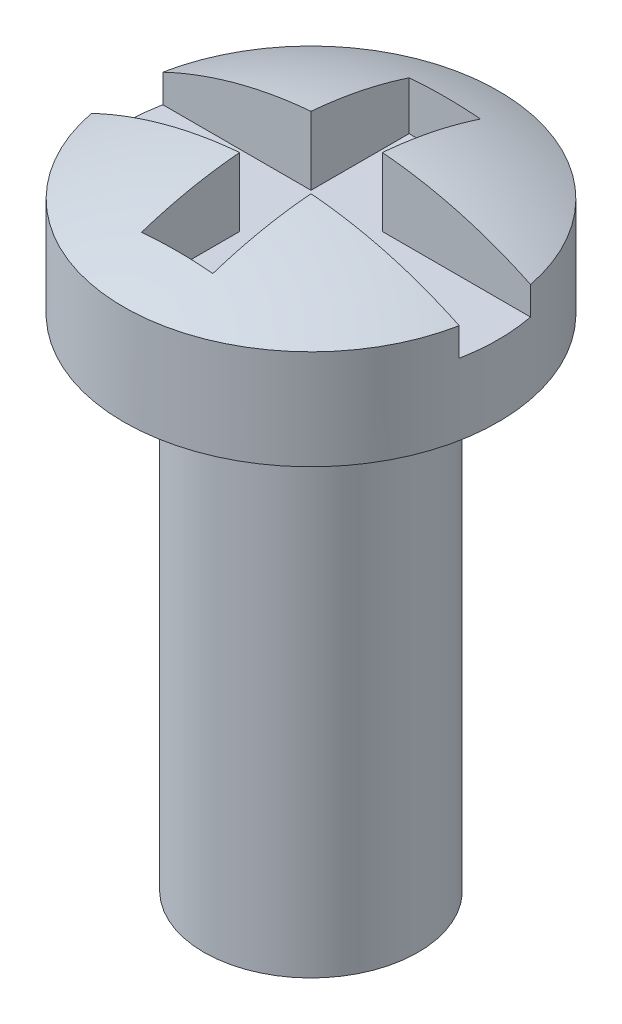
ISO-10303-21;
HEADER;
FILE_DESCRIPTION(('STEP AP214'),'2;1');
FILE_NAME('part.step','',(''),(''),'','','');
FILE_SCHEMA(('AUTOMOTIVE_DESIGN { 1 0 10303 214 1 1 1 1 }'));
ENDSEC;
DATA;
#1=APPLICATION_CONTEXT('core data for automotive mechanical design processes');
#2=APPLICATION_PROTOCOL_DEFINITION('international standard','automotive_design',2000,#1);
#3=PRODUCT_CONTEXT('',#1,'mechanical');
#4=PRODUCT('Part','Part','',(#3));
#5=PRODUCT_RELATED_PRODUCT_CATEGORY('part','',(#4));
#6=PRODUCT_DEFINITION_FORMATION('','',#4);
#7=PRODUCT_DEFINITION_CONTEXT('part definition',#1,'design');
#8=PRODUCT_DEFINITION('design','',#6,#7);
#9=PRODUCT_DEFINITION_SHAPE('','',#8);
#10=(LENGTH_UNIT() NAMED_UNIT(*) SI_UNIT(.MILLI.,.METRE.));
#11=(NAMED_UNIT(*) PLANE_ANGLE_UNIT() SI_UNIT($,.RADIAN.));
#12=(NAMED_UNIT(*) SI_UNIT($,.STERADIAN.) SOLID_ANGLE_UNIT());
#13=UNCERTAINTY_MEASURE_WITH_UNIT(LENGTH_MEASURE(1.E-05),#10,'distance_accuracy_value','');
#14=(GEOMETRIC_REPRESENTATION_CONTEXT(3) GLOBAL_UNCERTAINTY_ASSIGNED_CONTEXT((#13)) GLOBAL_UNIT_ASSIGNED_CONTEXT((#10,
#11,#12)) REPRESENTATION_CONTEXT('',''));
#15=CARTESIAN_POINT('',(0.,0.,0.));
#16=DIRECTION('',(0.,0.,1.));
#17=DIRECTION('',(1.,0.,0.));
#18=AXIS2_PLACEMENT_3D('',#15,#16,#17);
#19=CARTESIAN_POINT('',(-3.50234861591695,8.,-0.5));
#20=DIRECTION('',(0.,0.,-1.));
#21=DIRECTION('',(-1.,0.,0.));
#22=AXIS2_PLACEMENT_3D('',#19,#20,#21);
#23=PLANE('',#22);
#24=CARTESIAN_POINT('',(0.,3.,-0.5));
#25=DIRECTION('',(0.,0.,-1.));
#26=DIRECTION('',(-1.,0.,0.));
#27=AXIS2_PLACEMENT_3D('',#24,#25,#26);
#28=CIRCLE('',#27,5.9791303715507);
#29=CARTESIAN_POINT('',(-2.57694101601104,8.39531046372681,-0.5));
#30=VERTEX_POINT('',#29);
#31=CARTESIAN_POINT('',(-0.5,8.95818764390649,-0.5));
#32=VERTEX_POINT('',#31);
#33=EDGE_CURVE('E218',#30,#32,#28,.T.);
#34=ORIENTED_EDGE('',*,*,#33,.F.);
#35=DIRECTION('',(0.,-1.,0.));
#36=VECTOR('',#35,1.);
#37=CARTESIAN_POINT('',(-2.57694101601104,9.,-0.5));
#38=LINE('',#37,#36);
#39=CARTESIAN_POINT('',(-2.57694101601104,8.,-0.5));
#40=VERTEX_POINT('',#39);
#41=EDGE_CURVE('E161',#40,#30,#38,.F.);
#42=ORIENTED_EDGE('',*,*,#41,.F.);
#43=DIRECTION('',(-1.,0.,0.));
#44=VECTOR('',#43,1.);
#45=CARTESIAN_POINT('',(-3.50234861591695,8.,-0.5));
#46=LINE('',#45,#44);
#47=CARTESIAN_POINT('',(-0.5,8.,-0.5));
#48=VERTEX_POINT('',#47);
#49=EDGE_CURVE('E152',#48,#40,#46,.T.);
#50=ORIENTED_EDGE('',*,*,#49,.F.);
#51=DIRECTION('',(0.,1.,0.));
#52=VECTOR('',#51,1.);
#53=CARTESIAN_POINT('',(-0.5,8.,-0.5));
#54=LINE('',#53,#52);
#55=EDGE_CURVE('E145',#48,#32,#54,.T.);
#56=ORIENTED_EDGE('',*,*,#55,.T.);
#57=EDGE_LOOP('',(#34,#42,#50,#56));
#58=FACE_BOUND('',#57,.T.);
#59=ADVANCED_FACE('F29',(#58),#23,.F.);
#60=CARTESIAN_POINT('',(-3.50234861591695,8.,0.5));
#61=DIRECTION('',(0.,0.,1.));
#62=DIRECTION('',(1.,0.,0.));
#63=AXIS2_PLACEMENT_3D('',#60,#61,#62);
#64=PLANE('',#63);
#65=CARTESIAN_POINT('',(0.,3.,0.5));
#66=DIRECTION('',(0.,0.,1.));
#67=DIRECTION('',(1.,0.,0.));
#68=AXIS2_PLACEMENT_3D('',#65,#66,#67);
#69=CIRCLE('',#68,5.9791303715507);
#70=CARTESIAN_POINT('',(-0.499999999999999,8.95818764390649,0.5));
#71=VERTEX_POINT('',#70);
#72=CARTESIAN_POINT('',(-2.57694101601104,8.39531046372681,0.5));
#73=VERTEX_POINT('',#72);
#74=EDGE_CURVE('E188',#71,#73,#69,.T.);
#75=ORIENTED_EDGE('',*,*,#74,.F.);
#76=DIRECTION('',(0.,-1.,0.));
#77=VECTOR('',#76,1.);
#78=CARTESIAN_POINT('',(-0.5,8.,0.5));
#79=LINE('',#78,#77);
#80=CARTESIAN_POINT('',(-0.499999999999999,8.,0.5));
#81=VERTEX_POINT('',#80);
#82=EDGE_CURVE('E37',#71,#81,#79,.T.);
#83=ORIENTED_EDGE('',*,*,#82,.T.);
#84=DIRECTION('',(1.,0.,0.));
#85=VECTOR('',#84,1.);
#86=CARTESIAN_POINT('',(-3.50234861591695,8.,0.5));
#87=LINE('',#86,#85);
#88=CARTESIAN_POINT('',(-2.57694101601104,8.,0.5));
#89=VERTEX_POINT('',#88);
#90=EDGE_CURVE('E149',#89,#81,#87,.T.);
#91=ORIENTED_EDGE('',*,*,#90,.F.);
#92=DIRECTION('',(0.,-1.,0.));
#93=VECTOR('',#92,1.);
#94=CARTESIAN_POINT('',(-2.57694101601104,9.,0.5));
#95=LINE('',#94,#93);
#96=EDGE_CURVE('E159',#73,#89,#95,.T.);
#97=ORIENTED_EDGE('',*,*,#96,.F.);
#98=EDGE_LOOP('',(#75,#83,#91,#97));
#99=FACE_BOUND('',#98,.T.);
#100=ADVANCED_FACE('F186',(#99),#64,.F.);
#101=CARTESIAN_POINT('',(0.,9.,0.));
#102=DIRECTION('',(0.,-1.,0.));
#103=DIRECTION('',(0.,0.,-1.));
#104=AXIS2_PLACEMENT_3D('',#101,#102,#103);
#105=CYLINDRICAL_SURFACE('',#104,2.625);
#106=CARTESIAN_POINT('',(0.,7.,0.));
#107=DIRECTION('',(0.,1.,0.));
#108=DIRECTION('',(0.,0.,1.));
#109=AXIS2_PLACEMENT_3D('',#106,#107,#108);
#110=CIRCLE('',#109,2.625);
#111=CARTESIAN_POINT('',(0.,7.,2.625));
#112=VERTEX_POINT('',#111);
#113=EDGE_CURVE('E166',#112,#112,#110,.T.);
#114=ORIENTED_EDGE('',*,*,#113,.T.);
#115=EDGE_LOOP('',(#114));
#116=FACE_BOUND('',#115,.T.);
#117=CARTESIAN_POINT('',(0.,8.39531046372681,0.));
#118=DIRECTION('',(0.,-1.,0.));
#119=DIRECTION('',(0.,0.,-1.));
#120=AXIS2_PLACEMENT_3D('',#117,#118,#119);
#121=CIRCLE('',#120,2.625);
#122=CARTESIAN_POINT('',(2.57694101601104,8.39531046372681,0.5));
#123=VERTEX_POINT('',#122);
#124=EDGE_CURVE('E207',#73,#123,#121,.F.);
#125=ORIENTED_EDGE('',*,*,#124,.F.);
#126=ORIENTED_EDGE('',*,*,#96,.T.);
#127=CARTESIAN_POINT('',(0.,8.,0.));
#128=DIRECTION('',(0.,1.,0.));
#129=DIRECTION('',(0.,0.,1.));
#130=AXIS2_PLACEMENT_3D('',#127,#128,#129);
#131=CIRCLE('',#130,2.625);
#132=EDGE_CURVE('E175',#40,#89,#131,.T.);
#133=ORIENTED_EDGE('',*,*,#132,.F.);
#134=ORIENTED_EDGE('',*,*,#41,.T.);
#135=CARTESIAN_POINT('',(2.57694101601104,8.39531046372681,-0.5));
#136=VERTEX_POINT('',#135);
#137=EDGE_CURVE('E213',#136,#30,#121,.F.);
#138=ORIENTED_EDGE('',*,*,#137,.F.);
#139=DIRECTION('',(0.,-1.,0.));
#140=VECTOR('',#139,1.);
#141=CARTESIAN_POINT('',(2.57694101601104,9.,-0.5));
#142=LINE('',#141,#140);
#143=CARTESIAN_POINT('',(2.57694101601104,8.,-0.5));
#144=VERTEX_POINT('',#143);
#145=EDGE_CURVE('E164',#136,#144,#142,.T.);
#146=ORIENTED_EDGE('',*,*,#145,.T.);
#147=CARTESIAN_POINT('',(2.57694101601104,8.,0.5));
#148=VERTEX_POINT('',#147);
#149=EDGE_CURVE('E178',#148,#144,#131,.T.);
#150=ORIENTED_EDGE('',*,*,#149,.F.);
#151=DIRECTION('',(0.,-1.,0.));
#152=VECTOR('',#151,1.);
#153=CARTESIAN_POINT('',(2.57694101601104,9.,0.5));
#154=LINE('',#153,#152);
#155=EDGE_CURVE('E156',#148,#123,#154,.F.);
#156=ORIENTED_EDGE('',*,*,#155,.T.);
#157=EDGE_LOOP('',(#125,#126,#133,#134,#138,#146,#150,#156));
#158=FACE_BOUND('',#157,.T.);
#159=ADVANCED_FACE('F205',(#116,#158),#105,.T.);
#160=CARTESIAN_POINT('',(0.,3.,-0.5));
#161=DIRECTION('',(0.,0.,-1.));
#162=DIRECTION('',(-1.,0.,0.));
#163=AXIS2_PLACEMENT_3D('',#160,#161,#162);
#164=CIRCLE('',#163,5.9791303715507);
#165=CARTESIAN_POINT('',(0.5,8.95818764390649,-0.5));
#166=VERTEX_POINT('',#165);
#167=EDGE_CURVE('E219',#166,#136,#164,.T.);
#168=ORIENTED_EDGE('',*,*,#167,.F.);
#169=DIRECTION('',(0.,-1.,0.));
#170=VECTOR('',#169,1.);
#171=CARTESIAN_POINT('',(0.5,8.,-0.5));
#172=LINE('',#171,#170);
#173=CARTESIAN_POINT('',(0.5,8.,-0.5));
#174=VERTEX_POINT('',#173);
#175=EDGE_CURVE('E128',#166,#174,#172,.T.);
#176=ORIENTED_EDGE('',*,*,#175,.T.);
#177=EDGE_CURVE('E153',#144,#174,#46,.T.);
#178=ORIENTED_EDGE('',*,*,#177,.F.);
#179=ORIENTED_EDGE('',*,*,#145,.F.);
#180=EDGE_LOOP('',(#168,#176,#178,#179));
#181=FACE_BOUND('',#180,.T.);
#182=ADVANCED_FACE('F227',(#181),#23,.F.);
#183=CARTESIAN_POINT('',(0.,3.,0.5));
#184=DIRECTION('',(0.,0.,1.));
#185=DIRECTION('',(1.,0.,0.));
#186=AXIS2_PLACEMENT_3D('',#183,#184,#185);
#187=CIRCLE('',#186,5.9791303715507);
#188=CARTESIAN_POINT('',(0.5,8.95818764390649,0.5));
#189=VERTEX_POINT('',#188);
#190=EDGE_CURVE('E211',#123,#189,#187,.T.);
#191=ORIENTED_EDGE('',*,*,#190,.F.);
#192=ORIENTED_EDGE('',*,*,#155,.F.);
#193=CARTESIAN_POINT('',(0.5,8.,0.5));
#194=VERTEX_POINT('',#193);
#195=EDGE_CURVE('E148',#194,#148,#87,.T.);
#196=ORIENTED_EDGE('',*,*,#195,.F.);
#197=DIRECTION('',(0.,1.,0.));
#198=VECTOR('',#197,1.);
#199=CARTESIAN_POINT('',(0.5,8.,0.5));
#200=LINE('',#199,#198);
#201=EDGE_CURVE('E179',#194,#189,#200,.T.);
#202=ORIENTED_EDGE('',*,*,#201,.T.);
#203=EDGE_LOOP('',(#191,#192,#196,#202));
#204=FACE_BOUND('',#203,.T.);
#205=ADVANCED_FACE('F234',(#204),#64,.F.);
#206=CARTESIAN_POINT('',(0.5,8.,-1.875));
#207=DIRECTION('',(1.,0.,0.));
#208=DIRECTION('',(0.,0.,-1.));
#209=AXIS2_PLACEMENT_3D('',#206,#207,#208);
#210=PLANE('',#209);
#211=CARTESIAN_POINT('',(0.5,3.,0.));
#212=DIRECTION('',(1.,0.,0.));
#213=DIRECTION('',(0.,0.,-1.));
#214=AXIS2_PLACEMENT_3D('',#211,#212,#213);
#215=CIRCLE('',#214,5.9791303715507);
#216=CARTESIAN_POINT('',(0.499999999999999,8.67753247458788,1.875));
#217=VERTEX_POINT('',#216);
#218=EDGE_CURVE('E44',#189,#217,#215,.T.);
#219=ORIENTED_EDGE('',*,*,#218,.F.);
#220=ORIENTED_EDGE('',*,*,#201,.F.);
#221=DIRECTION('',(0.,0.,-1.));
#222=VECTOR('',#221,1.);
#223=CARTESIAN_POINT('',(0.5,8.,-1.875));
#224=LINE('',#223,#222);
#225=CARTESIAN_POINT('',(0.499999999999999,8.,1.875));
#226=VERTEX_POINT('',#225);
#227=EDGE_CURVE('E231',#226,#194,#224,.T.);
#228=ORIENTED_EDGE('',*,*,#227,.F.);
#229=DIRECTION('',(0.,1.,0.));
#230=VECTOR('',#229,1.);
#231=CARTESIAN_POINT('',(0.499999999999999,8.,1.875));
#232=LINE('',#231,#230);
#233=EDGE_CURVE('E134',#226,#217,#232,.T.);
#234=ORIENTED_EDGE('',*,*,#233,.T.);
#235=EDGE_LOOP('',(#219,#220,#228,#234));
#236=FACE_BOUND('',#235,.T.);
#237=ADVANCED_FACE('F237',(#236),#210,.F.);
#238=CARTESIAN_POINT('',(-0.5,8.,-1.875));
#239=DIRECTION('',(-1.,0.,0.));
#240=DIRECTION('',(0.,0.,1.));
#241=AXIS2_PLACEMENT_3D('',#238,#239,#240);
#242=PLANE('',#241);
#243=CARTESIAN_POINT('',(-0.5,3.,0.));
#244=DIRECTION('',(-1.,0.,0.));
#245=DIRECTION('',(0.,0.,1.));
#246=AXIS2_PLACEMENT_3D('',#243,#244,#245);
#247=CIRCLE('',#246,5.9791303715507);
#248=CARTESIAN_POINT('',(-0.499999999999999,8.67753247458788,1.875));
#249=VERTEX_POINT('',#248);
#250=EDGE_CURVE('E238',#249,#71,#247,.T.);
#251=ORIENTED_EDGE('',*,*,#250,.F.);
#252=DIRECTION('',(0.,1.,0.));
#253=VECTOR('',#252,1.);
#254=CARTESIAN_POINT('',(-0.499999999999999,8.,1.875));
#255=LINE('',#254,#253);
#256=CARTESIAN_POINT('',(-0.499999999999999,8.,1.875));
#257=VERTEX_POINT('',#256);
#258=EDGE_CURVE('E138',#257,#249,#255,.T.);
#259=ORIENTED_EDGE('',*,*,#258,.F.);
#260=DIRECTION('',(0.,0.,1.));
#261=VECTOR('',#260,1.);
#262=CARTESIAN_POINT('',(-0.5,8.,-1.875));
#263=LINE('',#262,#261);
#264=EDGE_CURVE('E192',#81,#257,#263,.T.);
#265=ORIENTED_EDGE('',*,*,#264,.F.);
#266=ORIENTED_EDGE('',*,*,#82,.F.);
#267=EDGE_LOOP('',(#251,#259,#265,#266));
#268=FACE_BOUND('',#267,.T.);
#269=ADVANCED_FACE('F193',(#268),#242,.F.);
#270=CARTESIAN_POINT('',(-0.499999999999999,8.,1.875));
#271=DIRECTION('',(0.,0.,1.));
#272=DIRECTION('',(1.,0.,0.));
#273=AXIS2_PLACEMENT_3D('',#270,#271,#272);
#274=PLANE('',#273);
#275=CARTESIAN_POINT('',(0.,3.,1.875));
#276=DIRECTION('',(0.,0.,1.));
#277=DIRECTION('',(1.,0.,0.));
#278=AXIS2_PLACEMENT_3D('',#275,#276,#277);
#279=CIRCLE('',#278,5.699506557589);
#280=EDGE_CURVE('E221',#217,#249,#279,.T.);
#281=ORIENTED_EDGE('',*,*,#280,.F.);
#282=ORIENTED_EDGE('',*,*,#233,.F.);
#283=DIRECTION('',(1.,0.,0.));
#284=VECTOR('',#283,1.);
#285=CARTESIAN_POINT('',(-0.499999999999999,8.,1.875));
#286=LINE('',#285,#284);
#287=EDGE_CURVE('E243',#257,#226,#286,.T.);
#288=ORIENTED_EDGE('',*,*,#287,.F.);
#289=ORIENTED_EDGE('',*,*,#258,.T.);
#290=EDGE_LOOP('',(#281,#282,#288,#289));
#291=FACE_BOUND('',#290,.T.);
#292=ADVANCED_FACE('F294',(#291),#274,.F.);
#293=CARTESIAN_POINT('',(-0.5,3.,0.));
#294=DIRECTION('',(-1.,0.,0.));
#295=DIRECTION('',(0.,0.,1.));
#296=AXIS2_PLACEMENT_3D('',#293,#294,#295);
#297=CIRCLE('',#296,5.9791303715507);
#298=CARTESIAN_POINT('',(-0.5,8.67753247458788,-1.875));
#299=VERTEX_POINT('',#298);
#300=EDGE_CURVE('E51',#32,#299,#297,.T.);
#301=ORIENTED_EDGE('',*,*,#300,.F.);
#302=ORIENTED_EDGE('',*,*,#55,.F.);
#303=CARTESIAN_POINT('',(-0.5,8.,-1.875));
#304=VERTEX_POINT('',#303);
#305=EDGE_CURVE('E197',#304,#48,#263,.T.);
#306=ORIENTED_EDGE('',*,*,#305,.F.);
#307=DIRECTION('',(0.,1.,0.));
#308=VECTOR('',#307,1.);
#309=CARTESIAN_POINT('',(-0.5,8.,-1.875));
#310=LINE('',#309,#308);
#311=EDGE_CURVE('E133',#304,#299,#310,.T.);
#312=ORIENTED_EDGE('',*,*,#311,.T.);
#313=EDGE_LOOP('',(#301,#302,#306,#312));
#314=FACE_BOUND('',#313,.T.);
#315=ADVANCED_FACE('F248',(#314),#242,.F.);
#316=CARTESIAN_POINT('',(0.5,3.,0.));
#317=DIRECTION('',(1.,0.,0.));
#318=DIRECTION('',(0.,0.,-1.));
#319=AXIS2_PLACEMENT_3D('',#316,#317,#318);
#320=CIRCLE('',#319,5.9791303715507);
#321=CARTESIAN_POINT('',(0.5,8.67753247458788,-1.875));
#322=VERTEX_POINT('',#321);
#323=EDGE_CURVE('E116',#322,#166,#320,.T.);
#324=ORIENTED_EDGE('',*,*,#323,.F.);
#325=DIRECTION('',(0.,1.,0.));
#326=VECTOR('',#325,1.);
#327=CARTESIAN_POINT('',(0.5,8.,-1.875));
#328=LINE('',#327,#326);
#329=CARTESIAN_POINT('',(0.5,8.,-1.875));
#330=VERTEX_POINT('',#329);
#331=EDGE_CURVE('E126',#330,#322,#328,.T.);
#332=ORIENTED_EDGE('',*,*,#331,.F.);
#333=EDGE_CURVE('E228',#174,#330,#224,.T.);
#334=ORIENTED_EDGE('',*,*,#333,.F.);
#335=ORIENTED_EDGE('',*,*,#175,.F.);
#336=EDGE_LOOP('',(#324,#332,#334,#335));
#337=FACE_BOUND('',#336,.T.);
#338=ADVANCED_FACE('F124',(#337),#210,.F.);
#339=CARTESIAN_POINT('',(-0.5,8.,-1.875));
#340=DIRECTION('',(0.,0.,-1.));
#341=DIRECTION('',(-1.,0.,0.));
#342=AXIS2_PLACEMENT_3D('',#339,#340,#341);
#343=PLANE('',#342);
#344=CARTESIAN_POINT('',(0.,3.,-1.875));
#345=DIRECTION('',(0.,0.,-1.));
#346=DIRECTION('',(-1.,0.,0.));
#347=AXIS2_PLACEMENT_3D('',#344,#345,#346);
#348=CIRCLE('',#347,5.699506557589);
#349=EDGE_CURVE('E11',#299,#322,#348,.T.);
#350=ORIENTED_EDGE('',*,*,#349,.F.);
#351=ORIENTED_EDGE('',*,*,#311,.F.);
#352=DIRECTION('',(-1.,0.,0.));
#353=VECTOR('',#352,1.);
#354=CARTESIAN_POINT('',(-0.5,8.,-1.875));
#355=LINE('',#354,#353);
#356=EDGE_CURVE('E132',#330,#304,#355,.T.);
#357=ORIENTED_EDGE('',*,*,#356,.F.);
#358=ORIENTED_EDGE('',*,*,#331,.T.);
#359=EDGE_LOOP('',(#350,#351,#357,#358));
#360=FACE_BOUND('',#359,.T.);
#361=ADVANCED_FACE('F130',(#360),#343,.F.);
#362=CARTESIAN_POINT('',(0.,7.,0.));
#363=DIRECTION('',(0.,-1.,0.));
#364=DIRECTION('',(0.,0.,-1.));
#365=AXIS2_PLACEMENT_3D('',#362,#363,#364);
#366=CYLINDRICAL_SURFACE('',#365,1.5);
#367=CARTESIAN_POINT('',(0.,7.,0.));
#368=DIRECTION('',(0.,1.,0.));
#369=DIRECTION('',(0.,0.,1.));
#370=AXIS2_PLACEMENT_3D('',#367,#368,#369);
#371=CIRCLE('',#370,1.5);
#372=CARTESIAN_POINT('',(0.,7.,1.5));
#373=VERTEX_POINT('',#372);
#374=EDGE_CURVE('E172',#373,#373,#371,.T.);
#375=ORIENTED_EDGE('',*,*,#374,.F.);
#376=EDGE_LOOP('',(#375));
#377=FACE_BOUND('',#376,.T.);
#378=CARTESIAN_POINT('',(0.,0.,0.));
#379=DIRECTION('',(0.,1.,0.));
#380=DIRECTION('',(0.,0.,1.));
#381=AXIS2_PLACEMENT_3D('',#378,#379,#380);
#382=CIRCLE('',#381,1.5);
#383=CARTESIAN_POINT('',(0.,0.,1.5));
#384=VERTEX_POINT('',#383);
#385=EDGE_CURVE('E169',#384,#384,#382,.T.);
#386=ORIENTED_EDGE('',*,*,#385,.T.);
#387=EDGE_LOOP('',(#386));
#388=FACE_BOUND('',#387,.T.);
#389=ADVANCED_FACE('F31',(#377,#388),#366,.T.);
#390=CARTESIAN_POINT('',(0.,0.,0.));
#391=DIRECTION('',(0.,1.,0.));
#392=DIRECTION('',(0.,0.,1.));
#393=AXIS2_PLACEMENT_3D('',#390,#391,#392);
#394=PLANE('',#393);
#395=ORIENTED_EDGE('',*,*,#385,.F.);
#396=EDGE_LOOP('',(#395));
#397=FACE_BOUND('',#396,.T.);
#398=ADVANCED_FACE('F269',(#397),#394,.F.);
#399=CARTESIAN_POINT('',(0.,7.,0.));
#400=DIRECTION('',(0.,1.,0.));
#401=DIRECTION('',(0.,0.,1.));
#402=AXIS2_PLACEMENT_3D('',#399,#400,#401);
#403=PLANE('',#402);
#404=ORIENTED_EDGE('',*,*,#113,.F.);
#405=EDGE_LOOP('',(#404));
#406=FACE_BOUND('',#405,.T.);
#407=ORIENTED_EDGE('',*,*,#374,.T.);
#408=EDGE_LOOP('',(#407));
#409=FACE_BOUND('',#408,.T.);
#410=ADVANCED_FACE('F268',(#406,#409),#403,.F.);
#411=CARTESIAN_POINT('',(-3.50234861591695,8.,0.5));
#412=DIRECTION('',(0.,1.,0.));
#413=DIRECTION('',(0.,0.,1.));
#414=AXIS2_PLACEMENT_3D('',#411,#412,#413);
#415=PLANE('',#414);
#416=ORIENTED_EDGE('',*,*,#177,.T.);
#417=ORIENTED_EDGE('',*,*,#333,.T.);
#418=ORIENTED_EDGE('',*,*,#356,.T.);
#419=ORIENTED_EDGE('',*,*,#305,.T.);
#420=ORIENTED_EDGE('',*,*,#49,.T.);
#421=ORIENTED_EDGE('',*,*,#132,.T.);
#422=ORIENTED_EDGE('',*,*,#90,.T.);
#423=ORIENTED_EDGE('',*,*,#264,.T.);
#424=ORIENTED_EDGE('',*,*,#287,.T.);
#425=ORIENTED_EDGE('',*,*,#227,.T.);
#426=ORIENTED_EDGE('',*,*,#195,.T.);
#427=ORIENTED_EDGE('',*,*,#149,.T.);
#428=EDGE_LOOP('',(#416,#417,#418,#419,#420,#421,#422,#423,#424,#425,#426,#427));
#429=FACE_BOUND('',#428,.T.);
#430=ADVANCED_FACE('F199',(#429),#415,.T.);
#431=CARTESIAN_POINT('',(0.,3.,0.));
#432=DIRECTION('',(0.,-1.,0.));
#433=DIRECTION('',(0.,0.,1.));
#434=AXIS2_PLACEMENT_3D('',#431,#432,#433);
#435=SPHERICAL_SURFACE('',#434,6.);
#436=ORIENTED_EDGE('',*,*,#33,.T.);
#437=ORIENTED_EDGE('',*,*,#300,.T.);
#438=ORIENTED_EDGE('',*,*,#349,.T.);
#439=ORIENTED_EDGE('',*,*,#323,.T.);
#440=ORIENTED_EDGE('',*,*,#167,.T.);
#441=ORIENTED_EDGE('',*,*,#137,.T.);
#442=EDGE_LOOP('',(#436,#437,#438,#439,#440,#441));
#443=FACE_BOUND('',#442,.T.);
#444=ADVANCED_FACE('F115',(#443),#435,.T.);
#445=ORIENTED_EDGE('',*,*,#74,.T.);
#446=ORIENTED_EDGE('',*,*,#124,.T.);
#447=ORIENTED_EDGE('',*,*,#190,.T.);
#448=ORIENTED_EDGE('',*,*,#218,.T.);
#449=ORIENTED_EDGE('',*,*,#280,.T.);
#450=ORIENTED_EDGE('',*,*,#250,.T.);
#451=EDGE_LOOP('',(#445,#446,#447,#448,#449,#450));
#452=FACE_BOUND('',#451,.T.);
#453=ADVANCED_FACE('F235',(#452),#435,.T.);
#454=CLOSED_SHELL('',(#59,#100,#159,#182,#205,#237,#269,#292,#315,#338,#361,#389,#398,#410,#430,
#444,#453));
#455=MANIFOLD_SOLID_BREP('B2',#454);
#456=ADVANCED_BREP_SHAPE_REPRESENTATION('',(#18,#455),#14);
#457=SHAPE_DEFINITION_REPRESENTATION(#9,#456);
ENDSEC;
END-ISO-10303-21;
